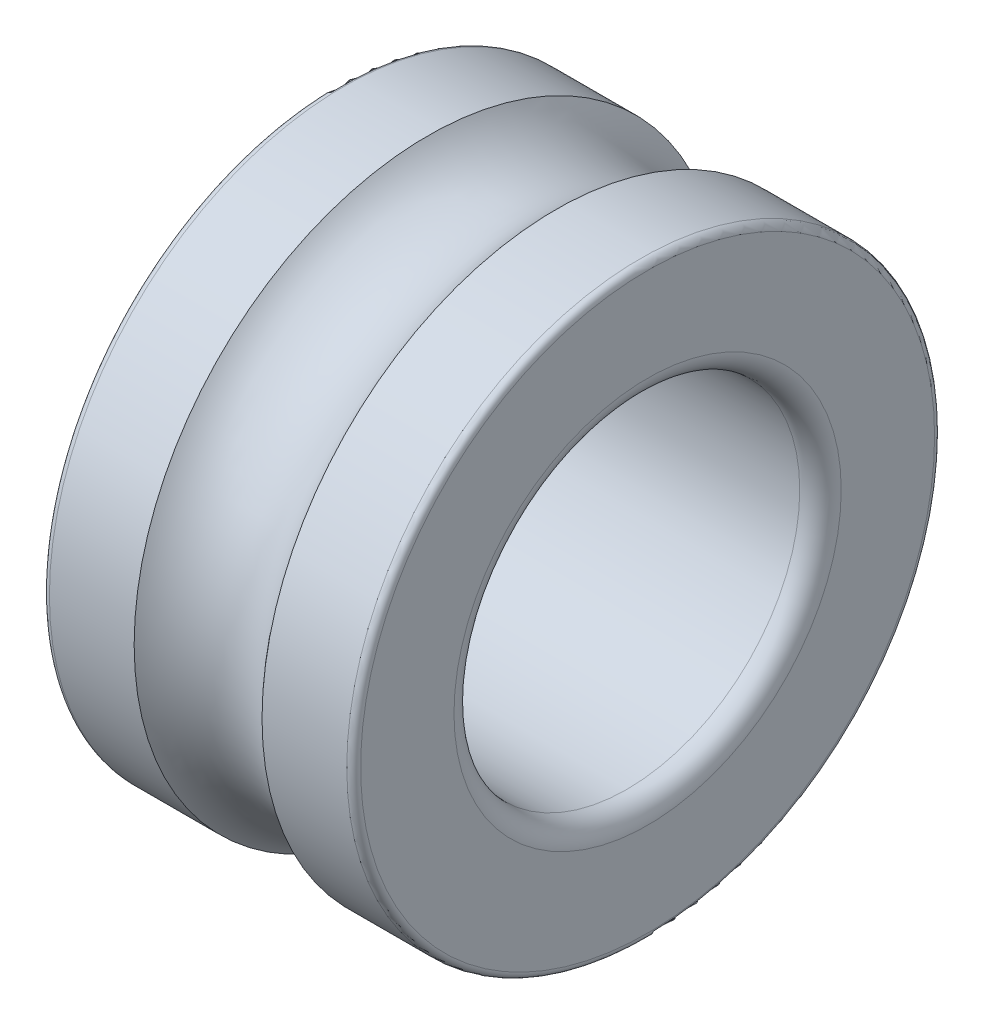
ISO-10303-21;
HEADER;
FILE_DESCRIPTION(('STEP AP214'),'2;1');
FILE_NAME('part.step','',(''),(''),'','','');
FILE_SCHEMA(('AUTOMOTIVE_DESIGN { 1 0 10303 214 1 1 1 1 }'));
ENDSEC;
DATA;
#1=APPLICATION_CONTEXT('core data for automotive mechanical design processes');
#2=APPLICATION_PROTOCOL_DEFINITION('international standard','automotive_design',2000,#1);
#3=PRODUCT_CONTEXT('',#1,'mechanical');
#4=PRODUCT('Part','Part','',(#3));
#5=PRODUCT_RELATED_PRODUCT_CATEGORY('part','',(#4));
#6=PRODUCT_DEFINITION_FORMATION('','',#4);
#7=PRODUCT_DEFINITION_CONTEXT('part definition',#1,'design');
#8=PRODUCT_DEFINITION('design','',#6,#7);
#9=PRODUCT_DEFINITION_SHAPE('','',#8);
#10=(LENGTH_UNIT() NAMED_UNIT(*) SI_UNIT(.MILLI.,.METRE.));
#11=(NAMED_UNIT(*) PLANE_ANGLE_UNIT() SI_UNIT($,.RADIAN.));
#12=(NAMED_UNIT(*) SI_UNIT($,.STERADIAN.) SOLID_ANGLE_UNIT());
#13=UNCERTAINTY_MEASURE_WITH_UNIT(LENGTH_MEASURE(1.E-05),#10,'distance_accuracy_value','');
#14=(GEOMETRIC_REPRESENTATION_CONTEXT(3) GLOBAL_UNCERTAINTY_ASSIGNED_CONTEXT((#13)) GLOBAL_UNIT_ASSIGNED_CONTEXT((#10,
#11,#12)) REPRESENTATION_CONTEXT('',''));
#15=CARTESIAN_POINT('',(0.,0.,0.));
#16=DIRECTION('',(0.,0.,1.));
#17=DIRECTION('',(1.,0.,0.));
#18=AXIS2_PLACEMENT_3D('',#15,#16,#17);
#19=CARTESIAN_POINT('',(4.5,0.,0.));
#20=DIRECTION('',(1.,0.,0.));
#21=DIRECTION('',(0.,0.,-1.));
#22=AXIS2_PLACEMENT_3D('',#19,#20,#21);
#23=TOROIDAL_SURFACE('',#22,10.,2.381);
#24=CARTESIAN_POINT('',(2.65090265264373,0.,0.));
#25=DIRECTION('',(-1.,0.,0.));
#26=DIRECTION('',(0.,0.,1.));
#27=AXIS2_PLACEMENT_3D('',#24,#25,#26);
#28=CIRCLE('',#27,8.5);
#29=CARTESIAN_POINT('',(2.65090265264373,0.,8.5));
#30=VERTEX_POINT('',#29);
#31=EDGE_CURVE('E143',#30,#30,#28,.T.);
#32=ORIENTED_EDGE('',*,*,#31,.F.);
#33=EDGE_LOOP('',(#32));
#34=FACE_BOUND('',#33,.T.);
#35=CARTESIAN_POINT('',(6.34909734735627,0.,0.));
#36=DIRECTION('',(-1.,0.,0.));
#37=DIRECTION('',(0.,0.,1.));
#38=AXIS2_PLACEMENT_3D('',#35,#36,#37);
#39=CIRCLE('',#38,8.5);
#40=CARTESIAN_POINT('',(6.34909734735627,0.,8.5));
#41=VERTEX_POINT('',#40);
#42=EDGE_CURVE('E151',#41,#41,#39,.F.);
#43=ORIENTED_EDGE('',*,*,#42,.F.);
#44=EDGE_LOOP('',(#43));
#45=FACE_BOUND('',#44,.T.);
#46=ADVANCED_FACE('F15',(#34,#45),#23,.F.);
#47=CARTESIAN_POINT('',(8.4,0.,0.));
#48=DIRECTION('',(-1.,0.,0.));
#49=DIRECTION('',(0.,0.,1.));
#50=AXIS2_PLACEMENT_3D('',#47,#48,#49);
#51=CYLINDRICAL_SURFACE('',#50,8.5);
#52=CARTESIAN_POINT('',(8.8,0.,0.));
#53=DIRECTION('',(1.,0.,0.));
#54=DIRECTION('',(0.,0.,-1.));
#55=AXIS2_PLACEMENT_3D('',#52,#53,#54);
#56=CIRCLE('',#55,8.5);
#57=CARTESIAN_POINT('',(8.8,0.,-8.5));
#58=VERTEX_POINT('',#57);
#59=EDGE_CURVE('E113',#58,#58,#56,.T.);
#60=ORIENTED_EDGE('',*,*,#59,.F.);
#61=EDGE_LOOP('',(#60));
#62=FACE_BOUND('',#61,.T.);
#63=ORIENTED_EDGE('',*,*,#42,.T.);
#64=EDGE_LOOP('',(#63));
#65=FACE_BOUND('',#64,.T.);
#66=ADVANCED_FACE('F158',(#62,#65),#51,.T.);
#67=CARTESIAN_POINT('',(8.4,0.,0.));
#68=DIRECTION('',(-1.,0.,0.));
#69=DIRECTION('',(0.,0.,1.));
#70=AXIS2_PLACEMENT_3D('',#67,#68,#69);
#71=CYLINDRICAL_SURFACE('',#70,8.5);
#72=ORIENTED_EDGE('',*,*,#31,.T.);
#73=EDGE_LOOP('',(#72));
#74=FACE_BOUND('',#73,.T.);
#75=CARTESIAN_POINT('',(0.2,0.,0.));
#76=DIRECTION('',(1.,0.,0.));
#77=DIRECTION('',(0.,0.,-1.));
#78=AXIS2_PLACEMENT_3D('',#75,#76,#77);
#79=CIRCLE('',#78,8.5);
#80=CARTESIAN_POINT('',(0.2,0.,-8.5));
#81=VERTEX_POINT('',#80);
#82=EDGE_CURVE('E110',#81,#81,#79,.F.);
#83=ORIENTED_EDGE('',*,*,#82,.F.);
#84=EDGE_LOOP('',(#83));
#85=FACE_BOUND('',#84,.T.);
#86=ADVANCED_FACE('F136',(#74,#85),#71,.T.);
#87=CARTESIAN_POINT('',(8.8,0.,0.));
#88=DIRECTION('',(1.,0.,0.));
#89=DIRECTION('',(0.,0.,-1.));
#90=AXIS2_PLACEMENT_3D('',#87,#88,#89);
#91=TOROIDAL_SURFACE('',#90,8.3,0.200000000000001);
#92=CARTESIAN_POINT('',(9.,0.,0.));
#93=DIRECTION('',(-1.,0.,0.));
#94=DIRECTION('',(0.,0.,-1.));
#95=AXIS2_PLACEMENT_3D('',#92,#93,#94);
#96=CIRCLE('',#95,8.3);
#97=CARTESIAN_POINT('',(9.,0.,-8.3));
#98=VERTEX_POINT('',#97);
#99=EDGE_CURVE('E65',#98,#98,#96,.F.);
#100=ORIENTED_EDGE('',*,*,#99,.F.);
#101=EDGE_LOOP('',(#100));
#102=FACE_BOUND('',#101,.T.);
#103=ORIENTED_EDGE('',*,*,#59,.T.);
#104=EDGE_LOOP('',(#103));
#105=FACE_BOUND('',#104,.T.);
#106=ADVANCED_FACE('F132',(#102,#105),#91,.T.);
#107=CARTESIAN_POINT('',(0.2,0.,0.));
#108=DIRECTION('',(1.,0.,0.));
#109=DIRECTION('',(0.,0.,-1.));
#110=AXIS2_PLACEMENT_3D('',#107,#108,#109);
#111=TOROIDAL_SURFACE('',#110,8.3,0.200000000000001);
#112=ORIENTED_EDGE('',*,*,#82,.T.);
#113=EDGE_LOOP('',(#112));
#114=FACE_BOUND('',#113,.T.);
#115=CARTESIAN_POINT('',(0.,0.,0.));
#116=DIRECTION('',(1.,0.,0.));
#117=DIRECTION('',(0.,0.,-1.));
#118=AXIS2_PLACEMENT_3D('',#115,#116,#117);
#119=CIRCLE('',#118,8.3);
#120=CARTESIAN_POINT('',(0.,0.,-8.3));
#121=VERTEX_POINT('',#120);
#122=EDGE_CURVE('E120',#121,#121,#119,.F.);
#123=ORIENTED_EDGE('',*,*,#122,.F.);
#124=EDGE_LOOP('',(#123));
#125=FACE_BOUND('',#124,.T.);
#126=ADVANCED_FACE('F82',(#114,#125),#111,.T.);
#127=CARTESIAN_POINT('',(9.,5.6,0.));
#128=DIRECTION('',(1.,0.,0.));
#129=DIRECTION('',(0.,0.,-1.));
#130=AXIS2_PLACEMENT_3D('',#127,#128,#129);
#131=PLANE('',#130);
#132=CARTESIAN_POINT('',(9.00000000000001,0.,0.));
#133=DIRECTION('',(1.,0.,0.));
#134=DIRECTION('',(0.,0.,-1.));
#135=AXIS2_PLACEMENT_3D('',#132,#133,#134);
#136=CIRCLE('',#135,5.6);
#137=CARTESIAN_POINT('',(9.00000000000001,0.,-5.6));
#138=VERTEX_POINT('',#137);
#139=EDGE_CURVE('E100',#138,#138,#136,.T.);
#140=ORIENTED_EDGE('',*,*,#139,.F.);
#141=EDGE_LOOP('',(#140));
#142=FACE_BOUND('',#141,.T.);
#143=ORIENTED_EDGE('',*,*,#99,.T.);
#144=EDGE_LOOP('',(#143));
#145=FACE_BOUND('',#144,.T.);
#146=ADVANCED_FACE('F72',(#142,#145),#131,.T.);
#147=CARTESIAN_POINT('',(0.,8.3,0.));
#148=DIRECTION('',(-1.,0.,0.));
#149=DIRECTION('',(0.,0.,1.));
#150=AXIS2_PLACEMENT_3D('',#147,#148,#149);
#151=PLANE('',#150);
#152=ORIENTED_EDGE('',*,*,#122,.T.);
#153=EDGE_LOOP('',(#152));
#154=FACE_BOUND('',#153,.T.);
#155=CARTESIAN_POINT('',(0.,0.,0.));
#156=DIRECTION('',(-1.,0.,0.));
#157=DIRECTION('',(0.,0.,-1.));
#158=AXIS2_PLACEMENT_3D('',#155,#156,#157);
#159=CIRCLE('',#158,5.6);
#160=CARTESIAN_POINT('',(0.,0.,-5.6));
#161=VERTEX_POINT('',#160);
#162=EDGE_CURVE('E27',#161,#161,#159,.T.);
#163=ORIENTED_EDGE('',*,*,#162,.F.);
#164=EDGE_LOOP('',(#163));
#165=FACE_BOUND('',#164,.T.);
#166=ADVANCED_FACE('F81',(#154,#165),#151,.T.);
#167=CARTESIAN_POINT('',(8.4,0.,0.));
#168=DIRECTION('',(1.,0.,0.));
#169=DIRECTION('',(0.,0.,-1.));
#170=AXIS2_PLACEMENT_3D('',#167,#168,#169);
#171=TOROIDAL_SURFACE('',#170,5.6,0.600000000000003);
#172=CARTESIAN_POINT('',(8.4,0.,0.));
#173=DIRECTION('',(-1.,0.,0.));
#174=DIRECTION('',(0.,0.,1.));
#175=AXIS2_PLACEMENT_3D('',#172,#173,#174);
#176=CIRCLE('',#175,5.);
#177=CARTESIAN_POINT('',(8.4,0.,5.));
#178=VERTEX_POINT('',#177);
#179=EDGE_CURVE('E22',#178,#178,#176,.T.);
#180=ORIENTED_EDGE('',*,*,#179,.T.);
#181=EDGE_LOOP('',(#180));
#182=FACE_BOUND('',#181,.T.);
#183=ORIENTED_EDGE('',*,*,#139,.T.);
#184=EDGE_LOOP('',(#183));
#185=FACE_BOUND('',#184,.T.);
#186=ADVANCED_FACE('F45',(#182,#185),#171,.T.);
#187=CARTESIAN_POINT('',(0.599999999999999,0.,0.));
#188=DIRECTION('',(1.,0.,0.));
#189=DIRECTION('',(0.,0.,-1.));
#190=AXIS2_PLACEMENT_3D('',#187,#188,#189);
#191=TOROIDAL_SURFACE('',#190,5.6,0.599999999999999);
#192=ORIENTED_EDGE('',*,*,#162,.T.);
#193=EDGE_LOOP('',(#192));
#194=FACE_BOUND('',#193,.T.);
#195=CARTESIAN_POINT('',(0.599999999999999,0.,0.));
#196=DIRECTION('',(-1.,0.,0.));
#197=DIRECTION('',(0.,0.,1.));
#198=AXIS2_PLACEMENT_3D('',#195,#196,#197);
#199=CIRCLE('',#198,5.);
#200=CARTESIAN_POINT('',(0.599999999999999,0.,5.));
#201=VERTEX_POINT('',#200);
#202=EDGE_CURVE('E10',#201,#201,#199,.F.);
#203=ORIENTED_EDGE('',*,*,#202,.T.);
#204=EDGE_LOOP('',(#203));
#205=FACE_BOUND('',#204,.T.);
#206=ADVANCED_FACE('F39',(#194,#205),#191,.T.);
#207=CARTESIAN_POINT('',(8.4,0.,0.));
#208=DIRECTION('',(-1.,0.,0.));
#209=DIRECTION('',(0.,0.,1.));
#210=AXIS2_PLACEMENT_3D('',#207,#208,#209);
#211=CYLINDRICAL_SURFACE('',#210,5.);
#212=ORIENTED_EDGE('',*,*,#202,.F.);
#213=EDGE_LOOP('',(#212));
#214=FACE_BOUND('',#213,.T.);
#215=ORIENTED_EDGE('',*,*,#179,.F.);
#216=EDGE_LOOP('',(#215));
#217=FACE_BOUND('',#216,.T.);
#218=ADVANCED_FACE('F44',(#214,#217),#211,.F.);
#219=CLOSED_SHELL('',(#46,#66,#86,#106,#126,#146,#166,#186,#206,#218));
#220=MANIFOLD_SOLID_BREP('B1',#219);
#221=ADVANCED_BREP_SHAPE_REPRESENTATION('',(#18,#220),#14);
#222=SHAPE_DEFINITION_REPRESENTATION(#9,#221);
ENDSEC;
END-ISO-10303-21;
